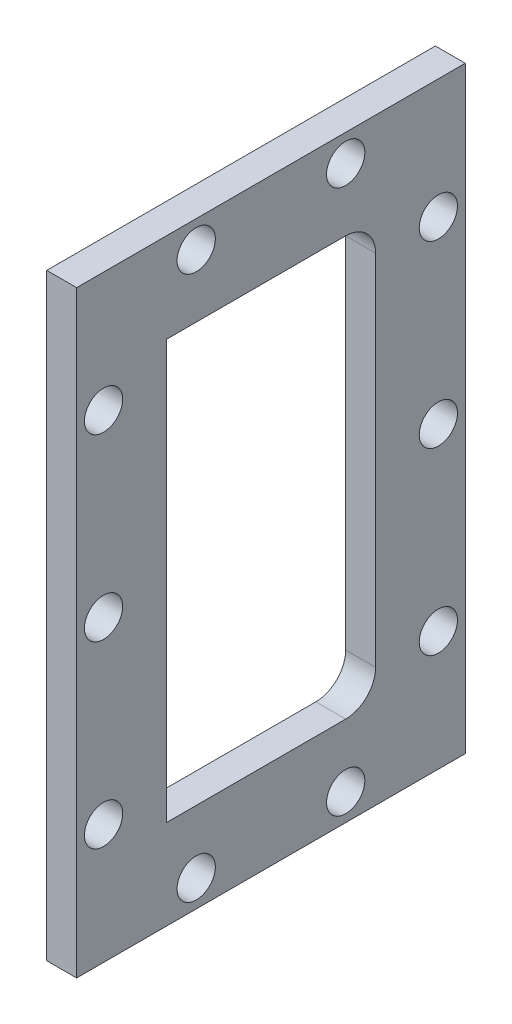
ISO-10303-21;
HEADER;
FILE_DESCRIPTION(('STEP AP214'),'2;1');
FILE_NAME('part.step','',(''),(''),'','','');
FILE_SCHEMA(('AUTOMOTIVE_DESIGN { 1 0 10303 214 1 1 1 1 }'));
ENDSEC;
DATA;
#1=APPLICATION_CONTEXT('core data for automotive mechanical design processes');
#2=APPLICATION_PROTOCOL_DEFINITION('international standard','automotive_design',2000,#1);
#3=PRODUCT_CONTEXT('',#1,'mechanical');
#4=PRODUCT('Part','Part','',(#3));
#5=PRODUCT_RELATED_PRODUCT_CATEGORY('part','',(#4));
#6=PRODUCT_DEFINITION_FORMATION('','',#4);
#7=PRODUCT_DEFINITION_CONTEXT('part definition',#1,'design');
#8=PRODUCT_DEFINITION('design','',#6,#7);
#9=PRODUCT_DEFINITION_SHAPE('','',#8);
#10=(LENGTH_UNIT() NAMED_UNIT(*) SI_UNIT(.MILLI.,.METRE.));
#11=(NAMED_UNIT(*) PLANE_ANGLE_UNIT() SI_UNIT($,.RADIAN.));
#12=(NAMED_UNIT(*) SI_UNIT($,.STERADIAN.) SOLID_ANGLE_UNIT());
#13=UNCERTAINTY_MEASURE_WITH_UNIT(LENGTH_MEASURE(1.E-05),#10,'distance_accuracy_value','');
#14=(GEOMETRIC_REPRESENTATION_CONTEXT(3) GLOBAL_UNCERTAINTY_ASSIGNED_CONTEXT((#13)) GLOBAL_UNIT_ASSIGNED_CONTEXT((#10,
#11,#12)) REPRESENTATION_CONTEXT('',''));
#15=CARTESIAN_POINT('',(0.,0.,0.));
#16=DIRECTION('',(0.,0.,1.));
#17=DIRECTION('',(1.,0.,0.));
#18=AXIS2_PLACEMENT_3D('',#15,#16,#17);
#19=CARTESIAN_POINT('',(4.99999,0.,0.));
#20=DIRECTION('',(-1.,0.,0.));
#21=DIRECTION('',(0.,0.,1.));
#22=AXIS2_PLACEMENT_3D('',#19,#20,#21);
#23=PLANE('',#22);
#24=CARTESIAN_POINT('',(4.99998999999991,19.99996,60.499879));
#25=DIRECTION('',(-1.,0.,0.));
#26=DIRECTION('',(0.,0.,1.));
#27=AXIS2_PLACEMENT_3D('',#24,#25,#26);
#28=CIRCLE('',#27,3.19999360000001);
#29=CARTESIAN_POINT('',(4.99998999999991,19.99996,63.6998726));
#30=VERTEX_POINT('',#29);
#31=EDGE_CURVE('E498',#30,#30,#28,.T.);
#32=ORIENTED_EDGE('',*,*,#31,.T.);
#33=EDGE_LOOP('',(#32));
#34=FACE_BOUND('',#33,.T.);
#35=CARTESIAN_POINT('',(4.99998999999992,4.499991,44.99991));
#36=DIRECTION('',(-1.,0.,0.));
#37=DIRECTION('',(0.,0.,1.));
#38=AXIS2_PLACEMENT_3D('',#35,#36,#37);
#39=CIRCLE('',#38,3.19999360000001);
#40=CARTESIAN_POINT('',(4.99998999999992,4.499991,48.1999036));
#41=VERTEX_POINT('',#40);
#42=EDGE_CURVE('E492',#41,#41,#39,.T.);
#43=ORIENTED_EDGE('',*,*,#42,.T.);
#44=EDGE_LOOP('',(#43));
#45=FACE_BOUND('',#44,.T.);
#46=CARTESIAN_POINT('',(4.99998999999992,4.499991,19.99996));
#47=DIRECTION('',(-1.,0.,0.));
#48=DIRECTION('',(0.,0.,1.));
#49=AXIS2_PLACEMENT_3D('',#46,#47,#48);
#50=CIRCLE('',#49,3.19999360000001);
#51=CARTESIAN_POINT('',(4.99998999999992,4.499991,23.1999536));
#52=VERTEX_POINT('',#51);
#53=EDGE_CURVE('E511',#52,#52,#50,.T.);
#54=ORIENTED_EDGE('',*,*,#53,.T.);
#55=EDGE_LOOP('',(#54));
#56=FACE_BOUND('',#55,.T.);
#57=CARTESIAN_POINT('',(4.99998999999993,19.99996,4.499991));
#58=DIRECTION('',(-1.,0.,0.));
#59=DIRECTION('',(0.,0.,1.));
#60=AXIS2_PLACEMENT_3D('',#57,#58,#59);
#61=CIRCLE('',#60,3.19999360000001);
#62=CARTESIAN_POINT('',(4.99998999999992,19.99996,7.69998460000001));
#63=VERTEX_POINT('',#62);
#64=EDGE_CURVE('E519',#63,#63,#61,.T.);
#65=ORIENTED_EDGE('',*,*,#64,.T.);
#66=EDGE_LOOP('',(#65));
#67=FACE_BOUND('',#66,.T.);
#68=CARTESIAN_POINT('',(4.99998999999993,49.9999,4.499991));
#69=DIRECTION('',(-1.,0.,0.));
#70=DIRECTION('',(0.,0.,1.));
#71=AXIS2_PLACEMENT_3D('',#68,#69,#70);
#72=CIRCLE('',#71,3.19999360000001);
#73=CARTESIAN_POINT('',(4.99998999999992,49.9999,7.69998460000001));
#74=VERTEX_POINT('',#73);
#75=EDGE_CURVE('E527',#74,#74,#72,.T.);
#76=ORIENTED_EDGE('',*,*,#75,.T.);
#77=EDGE_LOOP('',(#76));
#78=FACE_BOUND('',#77,.T.);
#79=CARTESIAN_POINT('',(4.99998999999993,79.99984,4.499991));
#80=DIRECTION('',(-1.,0.,0.));
#81=DIRECTION('',(0.,0.,1.));
#82=AXIS2_PLACEMENT_3D('',#79,#80,#81);
#83=CIRCLE('',#82,3.19999360000001);
#84=CARTESIAN_POINT('',(4.99998999999992,79.99984,7.69998460000001));
#85=VERTEX_POINT('',#84);
#86=EDGE_CURVE('E535',#85,#85,#83,.T.);
#87=ORIENTED_EDGE('',*,*,#86,.T.);
#88=EDGE_LOOP('',(#87));
#89=FACE_BOUND('',#88,.T.);
#90=CARTESIAN_POINT('',(4.99998999999992,95.499809,19.99996));
#91=DIRECTION('',(-1.,0.,0.));
#92=DIRECTION('',(0.,0.,1.));
#93=AXIS2_PLACEMENT_3D('',#90,#91,#92);
#94=CIRCLE('',#93,3.19999360000001);
#95=CARTESIAN_POINT('',(4.99998999999992,95.499809,23.1999536));
#96=VERTEX_POINT('',#95);
#97=EDGE_CURVE('E543',#96,#96,#94,.T.);
#98=ORIENTED_EDGE('',*,*,#97,.T.);
#99=EDGE_LOOP('',(#98));
#100=FACE_BOUND('',#99,.T.);
#101=CARTESIAN_POINT('',(4.99998999999992,95.4998089999999,44.99991));
#102=DIRECTION('',(-1.,0.,0.));
#103=DIRECTION('',(0.,0.,1.));
#104=AXIS2_PLACEMENT_3D('',#101,#102,#103);
#105=CIRCLE('',#104,3.19999360000001);
#106=CARTESIAN_POINT('',(4.99998999999992,95.4998089999999,48.1999036));
#107=VERTEX_POINT('',#106);
#108=EDGE_CURVE('E551',#107,#107,#105,.T.);
#109=ORIENTED_EDGE('',*,*,#108,.T.);
#110=EDGE_LOOP('',(#109));
#111=FACE_BOUND('',#110,.T.);
#112=CARTESIAN_POINT('',(4.99998999999991,79.99984,60.499879));
#113=DIRECTION('',(-1.,0.,0.));
#114=DIRECTION('',(0.,0.,1.));
#115=AXIS2_PLACEMENT_3D('',#112,#113,#114);
#116=CIRCLE('',#115,3.19999360000001);
#117=CARTESIAN_POINT('',(4.99998999999991,79.99984,63.6998726));
#118=VERTEX_POINT('',#117);
#119=EDGE_CURVE('E559',#118,#118,#116,.T.);
#120=ORIENTED_EDGE('',*,*,#119,.T.);
#121=EDGE_LOOP('',(#120));
#122=FACE_BOUND('',#121,.T.);
#123=CARTESIAN_POINT('',(4.99998999999991,49.9999,60.499879));
#124=DIRECTION('',(-1.,0.,0.));
#125=DIRECTION('',(0.,0.,1.));
#126=AXIS2_PLACEMENT_3D('',#123,#124,#125);
#127=CIRCLE('',#126,3.19999360000001);
#128=CARTESIAN_POINT('',(4.99998999999991,49.9999,63.6998726));
#129=VERTEX_POINT('',#128);
#130=EDGE_CURVE('E162',#129,#129,#127,.T.);
#131=ORIENTED_EDGE('',*,*,#130,.T.);
#132=EDGE_LOOP('',(#131));
#133=FACE_BOUND('',#132,.T.);
#134=DIRECTION('',(0.,0.,1.));
#135=VECTOR('',#134,1.);
#136=CARTESIAN_POINT('',(4.99999,0.,0.));
#137=LINE('',#136,#135);
#138=CARTESIAN_POINT('',(4.99999,0.,0.));
#139=VERTEX_POINT('',#138);
#140=CARTESIAN_POINT('',(4.99998999999999,0.,64.99987));
#141=VERTEX_POINT('',#140);
#142=EDGE_CURVE('E186',#139,#141,#137,.T.);
#143=ORIENTED_EDGE('',*,*,#142,.F.);
#144=DIRECTION('',(0.,-1.,0.));
#145=VECTOR('',#144,1.);
#146=CARTESIAN_POINT('',(4.99999,99.9998,0.));
#147=LINE('',#146,#145);
#148=CARTESIAN_POINT('',(4.99999,99.9998,0.));
#149=VERTEX_POINT('',#148);
#150=EDGE_CURVE('E199',#149,#139,#147,.T.);
#151=ORIENTED_EDGE('',*,*,#150,.F.);
#152=DIRECTION('',(0.,0.,-1.));
#153=VECTOR('',#152,1.);
#154=CARTESIAN_POINT('',(4.99998999999999,99.9998,64.99987));
#155=LINE('',#154,#153);
#156=CARTESIAN_POINT('',(4.99998999999999,99.9998,64.99987));
#157=VERTEX_POINT('',#156);
#158=EDGE_CURVE('E195',#157,#149,#155,.T.);
#159=ORIENTED_EDGE('',*,*,#158,.F.);
#160=DIRECTION('',(0.,1.,0.));
#161=VECTOR('',#160,1.);
#162=CARTESIAN_POINT('',(4.99998999999999,0.,64.99987));
#163=LINE('',#162,#161);
#164=EDGE_CURVE('E190',#141,#157,#163,.T.);
#165=ORIENTED_EDGE('',*,*,#164,.F.);
#166=EDGE_LOOP('',(#143,#151,#159,#165));
#167=FACE_BOUND('',#166,.T.);
#168=DIRECTION('',(0.,0.,1.));
#169=VECTOR('',#168,1.);
#170=CARTESIAN_POINT('',(4.9999899999999,84.99983,14.99997));
#171=LINE('',#170,#169);
#172=CARTESIAN_POINT('',(4.9999899999999,84.99983,19.99996));
#173=VERTEX_POINT('',#172);
#174=CARTESIAN_POINT('',(4.9999899999999,84.99983,49.9999));
#175=VERTEX_POINT('',#174);
#176=EDGE_CURVE('E151',#173,#175,#171,.T.);
#177=ORIENTED_EDGE('',*,*,#176,.F.);
#178=CARTESIAN_POINT('',(4.99999,79.99984,19.99996));
#179=DIRECTION('',(-1.,0.,0.));
#180=DIRECTION('',(0.,0.,1.));
#181=AXIS2_PLACEMENT_3D('',#178,#179,#180);
#182=CIRCLE('',#181,4.99999);
#183=CARTESIAN_POINT('',(4.9999899999999,79.99984,14.99997));
#184=VERTEX_POINT('',#183);
#185=EDGE_CURVE('E54',#173,#184,#182,.T.);
#186=ORIENTED_EDGE('',*,*,#185,.T.);
#187=DIRECTION('',(0.,-1.,0.));
#188=VECTOR('',#187,1.);
#189=CARTESIAN_POINT('',(4.9999899999999,84.99983,14.99997));
#190=LINE('',#189,#188);
#191=CARTESIAN_POINT('',(4.9999899999999,19.99996,14.99997));
#192=VERTEX_POINT('',#191);
#193=EDGE_CURVE('E179',#184,#192,#190,.T.);
#194=ORIENTED_EDGE('',*,*,#193,.T.);
#195=CARTESIAN_POINT('',(4.99999,19.99996,19.99996));
#196=DIRECTION('',(-1.,0.,0.));
#197=DIRECTION('',(0.,0.,1.));
#198=AXIS2_PLACEMENT_3D('',#195,#196,#197);
#199=CIRCLE('',#198,4.99999);
#200=CARTESIAN_POINT('',(4.9999899999999,14.99997,19.99996));
#201=VERTEX_POINT('',#200);
#202=EDGE_CURVE('E242',#192,#201,#199,.T.);
#203=ORIENTED_EDGE('',*,*,#202,.T.);
#204=DIRECTION('',(0.,0.,1.));
#205=VECTOR('',#204,1.);
#206=CARTESIAN_POINT('',(4.9999899999999,14.99997,14.99997));
#207=LINE('',#206,#205);
#208=CARTESIAN_POINT('',(4.99998999999999,14.99997,49.9999));
#209=VERTEX_POINT('',#208);
#210=EDGE_CURVE('E165',#201,#209,#207,.T.);
#211=ORIENTED_EDGE('',*,*,#210,.T.);
#212=DIRECTION('',(0.,-1.,0.));
#213=VECTOR('',#212,1.);
#214=CARTESIAN_POINT('',(4.9999899999999,84.99983,49.9999));
#215=LINE('',#214,#213);
#216=EDGE_CURVE('E175',#175,#209,#215,.T.);
#217=ORIENTED_EDGE('',*,*,#216,.F.);
#218=EDGE_LOOP('',(#177,#186,#194,#203,#211,#217));
#219=FACE_BOUND('',#218,.T.);
#220=ADVANCED_FACE('F45',(#34,#45,#56,#67,#78,#89,#100,#111,#122,#133,#167,#219),#23,.F.);
#221=CARTESIAN_POINT('',(0.,0.,0.));
#222=DIRECTION('',(-1.,0.,0.));
#223=DIRECTION('',(0.,0.,1.));
#224=AXIS2_PLACEMENT_3D('',#221,#222,#223);
#225=PLANE('',#224);
#226=CARTESIAN_POINT('',(0.,19.99996,60.499879));
#227=DIRECTION('',(-1.,0.,0.));
#228=DIRECTION('',(0.,0.,1.));
#229=AXIS2_PLACEMENT_3D('',#226,#227,#228);
#230=CIRCLE('',#229,3.19999360000001);
#231=CARTESIAN_POINT('',(0.,19.99996,63.6998726));
#232=VERTEX_POINT('',#231);
#233=EDGE_CURVE('E504',#232,#232,#230,.T.);
#234=ORIENTED_EDGE('',*,*,#233,.F.);
#235=EDGE_LOOP('',(#234));
#236=FACE_BOUND('',#235,.T.);
#237=CARTESIAN_POINT('',(0.,4.499991,44.99991));
#238=DIRECTION('',(-1.,0.,0.));
#239=DIRECTION('',(0.,0.,1.));
#240=AXIS2_PLACEMENT_3D('',#237,#238,#239);
#241=CIRCLE('',#240,3.19999360000001);
#242=CARTESIAN_POINT('',(0.,4.499991,48.1999036));
#243=VERTEX_POINT('',#242);
#244=EDGE_CURVE('E495',#243,#243,#241,.T.);
#245=ORIENTED_EDGE('',*,*,#244,.F.);
#246=EDGE_LOOP('',(#245));
#247=FACE_BOUND('',#246,.T.);
#248=CARTESIAN_POINT('',(0.,4.499991,19.99996));
#249=DIRECTION('',(-1.,0.,0.));
#250=DIRECTION('',(0.,0.,1.));
#251=AXIS2_PLACEMENT_3D('',#248,#249,#250);
#252=CIRCLE('',#251,3.19999360000001);
#253=CARTESIAN_POINT('',(0.,4.499991,23.1999536));
#254=VERTEX_POINT('',#253);
#255=EDGE_CURVE('E502',#254,#254,#252,.T.);
#256=ORIENTED_EDGE('',*,*,#255,.F.);
#257=EDGE_LOOP('',(#256));
#258=FACE_BOUND('',#257,.T.);
#259=CARTESIAN_POINT('',(0.,19.99996,4.499991));
#260=DIRECTION('',(-1.,0.,0.));
#261=DIRECTION('',(0.,0.,1.));
#262=AXIS2_PLACEMENT_3D('',#259,#260,#261);
#263=CIRCLE('',#262,3.19999360000001);
#264=CARTESIAN_POINT('',(0.,19.99996,7.69998460000001));
#265=VERTEX_POINT('',#264);
#266=EDGE_CURVE('E515',#265,#265,#263,.T.);
#267=ORIENTED_EDGE('',*,*,#266,.F.);
#268=EDGE_LOOP('',(#267));
#269=FACE_BOUND('',#268,.T.);
#270=CARTESIAN_POINT('',(0.,49.9999,4.499991));
#271=DIRECTION('',(-1.,0.,0.));
#272=DIRECTION('',(0.,0.,1.));
#273=AXIS2_PLACEMENT_3D('',#270,#271,#272);
#274=CIRCLE('',#273,3.19999360000001);
#275=CARTESIAN_POINT('',(0.,49.9999,7.69998460000001));
#276=VERTEX_POINT('',#275);
#277=EDGE_CURVE('E523',#276,#276,#274,.T.);
#278=ORIENTED_EDGE('',*,*,#277,.F.);
#279=EDGE_LOOP('',(#278));
#280=FACE_BOUND('',#279,.T.);
#281=CARTESIAN_POINT('',(0.,79.99984,4.499991));
#282=DIRECTION('',(-1.,0.,0.));
#283=DIRECTION('',(0.,0.,1.));
#284=AXIS2_PLACEMENT_3D('',#281,#282,#283);
#285=CIRCLE('',#284,3.19999360000001);
#286=CARTESIAN_POINT('',(0.,79.99984,7.69998460000001));
#287=VERTEX_POINT('',#286);
#288=EDGE_CURVE('E531',#287,#287,#285,.T.);
#289=ORIENTED_EDGE('',*,*,#288,.F.);
#290=EDGE_LOOP('',(#289));
#291=FACE_BOUND('',#290,.T.);
#292=CARTESIAN_POINT('',(0.,95.499809,19.99996));
#293=DIRECTION('',(-1.,0.,0.));
#294=DIRECTION('',(0.,0.,1.));
#295=AXIS2_PLACEMENT_3D('',#292,#293,#294);
#296=CIRCLE('',#295,3.19999360000001);
#297=CARTESIAN_POINT('',(0.,95.499809,23.1999536));
#298=VERTEX_POINT('',#297);
#299=EDGE_CURVE('E539',#298,#298,#296,.T.);
#300=ORIENTED_EDGE('',*,*,#299,.F.);
#301=EDGE_LOOP('',(#300));
#302=FACE_BOUND('',#301,.T.);
#303=CARTESIAN_POINT('',(0.,95.4998089999999,44.99991));
#304=DIRECTION('',(-1.,0.,0.));
#305=DIRECTION('',(0.,0.,1.));
#306=AXIS2_PLACEMENT_3D('',#303,#304,#305);
#307=CIRCLE('',#306,3.19999360000001);
#308=CARTESIAN_POINT('',(0.,95.4998089999999,48.1999036));
#309=VERTEX_POINT('',#308);
#310=EDGE_CURVE('E547',#309,#309,#307,.T.);
#311=ORIENTED_EDGE('',*,*,#310,.F.);
#312=EDGE_LOOP('',(#311));
#313=FACE_BOUND('',#312,.T.);
#314=CARTESIAN_POINT('',(0.,79.99984,60.499879));
#315=DIRECTION('',(-1.,0.,0.));
#316=DIRECTION('',(0.,0.,1.));
#317=AXIS2_PLACEMENT_3D('',#314,#315,#316);
#318=CIRCLE('',#317,3.19999360000001);
#319=CARTESIAN_POINT('',(0.,79.99984,63.6998726));
#320=VERTEX_POINT('',#319);
#321=EDGE_CURVE('E555',#320,#320,#318,.T.);
#322=ORIENTED_EDGE('',*,*,#321,.F.);
#323=EDGE_LOOP('',(#322));
#324=FACE_BOUND('',#323,.T.);
#325=CARTESIAN_POINT('',(0.,49.9999,60.499879));
#326=DIRECTION('',(-1.,0.,0.));
#327=DIRECTION('',(0.,0.,1.));
#328=AXIS2_PLACEMENT_3D('',#325,#326,#327);
#329=CIRCLE('',#328,3.19999360000001);
#330=CARTESIAN_POINT('',(0.,49.9999,63.6998726));
#331=VERTEX_POINT('',#330);
#332=EDGE_CURVE('E563',#331,#331,#329,.T.);
#333=ORIENTED_EDGE('',*,*,#332,.F.);
#334=EDGE_LOOP('',(#333));
#335=FACE_BOUND('',#334,.T.);
#336=DIRECTION('',(0.,0.,1.));
#337=VECTOR('',#336,1.);
#338=CARTESIAN_POINT('',(0.,0.,0.));
#339=LINE('',#338,#337);
#340=CARTESIAN_POINT('',(0.,0.,0.));
#341=VERTEX_POINT('',#340);
#342=CARTESIAN_POINT('',(0.,0.,64.99987));
#343=VERTEX_POINT('',#342);
#344=EDGE_CURVE('E174',#341,#343,#339,.T.);
#345=ORIENTED_EDGE('',*,*,#344,.T.);
#346=DIRECTION('',(0.,1.,0.));
#347=VECTOR('',#346,1.);
#348=CARTESIAN_POINT('',(0.,0.,64.99987));
#349=LINE('',#348,#347);
#350=CARTESIAN_POINT('',(0.,99.9998,64.99987));
#351=VERTEX_POINT('',#350);
#352=EDGE_CURVE('E207',#343,#351,#349,.T.);
#353=ORIENTED_EDGE('',*,*,#352,.T.);
#354=DIRECTION('',(0.,0.,-1.));
#355=VECTOR('',#354,1.);
#356=CARTESIAN_POINT('',(0.,99.9998,64.99987));
#357=LINE('',#356,#355);
#358=CARTESIAN_POINT('',(0.,99.9998,0.));
#359=VERTEX_POINT('',#358);
#360=EDGE_CURVE('E211',#351,#359,#357,.T.);
#361=ORIENTED_EDGE('',*,*,#360,.T.);
#362=DIRECTION('',(0.,-1.,0.));
#363=VECTOR('',#362,1.);
#364=CARTESIAN_POINT('',(0.,99.9998,0.));
#365=LINE('',#364,#363);
#366=EDGE_CURVE('E191',#359,#341,#365,.T.);
#367=ORIENTED_EDGE('',*,*,#366,.T.);
#368=EDGE_LOOP('',(#345,#353,#361,#367));
#369=FACE_BOUND('',#368,.T.);
#370=DIRECTION('',(0.,-1.,0.));
#371=VECTOR('',#370,1.);
#372=CARTESIAN_POINT('',(0.,84.99983,14.99997));
#373=LINE('',#372,#371);
#374=CARTESIAN_POINT('',(0.,79.99984,14.99997));
#375=VERTEX_POINT('',#374);
#376=CARTESIAN_POINT('',(0.,19.99996,14.99997));
#377=VERTEX_POINT('',#376);
#378=EDGE_CURVE('E139',#375,#377,#373,.T.);
#379=ORIENTED_EDGE('',*,*,#378,.F.);
#380=CARTESIAN_POINT('',(0.,79.99984,19.99996));
#381=DIRECTION('',(-1.,0.,0.));
#382=DIRECTION('',(0.,0.,1.));
#383=AXIS2_PLACEMENT_3D('',#380,#381,#382);
#384=CIRCLE('',#383,4.99999);
#385=CARTESIAN_POINT('',(0.,84.99983,19.99996));
#386=VERTEX_POINT('',#385);
#387=EDGE_CURVE('E11',#375,#386,#384,.F.);
#388=ORIENTED_EDGE('',*,*,#387,.T.);
#389=DIRECTION('',(0.,0.,-1.));
#390=VECTOR('',#389,1.);
#391=CARTESIAN_POINT('',(0.,84.99983,53.999892));
#392=LINE('',#391,#390);
#393=CARTESIAN_POINT('',(0.,84.99983,53.999892));
#394=VERTEX_POINT('',#393);
#395=EDGE_CURVE('E144',#394,#386,#392,.T.);
#396=ORIENTED_EDGE('',*,*,#395,.F.);
#397=DIRECTION('',(0.,-1.,0.));
#398=VECTOR('',#397,1.);
#399=CARTESIAN_POINT('',(0.,84.99983,53.999892));
#400=LINE('',#399,#398);
#401=CARTESIAN_POINT('',(0.,14.99997,53.999892));
#402=VERTEX_POINT('',#401);
#403=EDGE_CURVE('E130',#394,#402,#400,.T.);
#404=ORIENTED_EDGE('',*,*,#403,.T.);
#405=DIRECTION('',(0.,0.,-1.));
#406=VECTOR('',#405,1.);
#407=CARTESIAN_POINT('',(0.,14.99997,53.999892));
#408=LINE('',#407,#406);
#409=CARTESIAN_POINT('',(0.,14.99997,19.99996));
#410=VERTEX_POINT('',#409);
#411=EDGE_CURVE('E161',#402,#410,#408,.T.);
#412=ORIENTED_EDGE('',*,*,#411,.T.);
#413=CARTESIAN_POINT('',(0.,19.99996,19.99996));
#414=DIRECTION('',(-1.,0.,0.));
#415=DIRECTION('',(0.,0.,1.));
#416=AXIS2_PLACEMENT_3D('',#413,#414,#415);
#417=CIRCLE('',#416,4.99999);
#418=EDGE_CURVE('E245',#410,#377,#417,.F.);
#419=ORIENTED_EDGE('',*,*,#418,.T.);
#420=EDGE_LOOP('',(#379,#388,#396,#404,#412,#419));
#421=FACE_BOUND('',#420,.T.);
#422=ADVANCED_FACE('F149',(#236,#247,#258,#269,#280,#291,#302,#313,#324,#335,#369,#421),#225,.T.);
#423=CARTESIAN_POINT('',(4.99999,0.,0.));
#424=DIRECTION('',(0.,-1.,0.));
#425=DIRECTION('',(0.,0.,-1.));
#426=AXIS2_PLACEMENT_3D('',#423,#424,#425);
#427=PLANE('',#426);
#428=ORIENTED_EDGE('',*,*,#344,.F.);
#429=DIRECTION('',(-1.,0.,0.));
#430=VECTOR('',#429,1.);
#431=CARTESIAN_POINT('',(4.99999,0.,0.));
#432=LINE('',#431,#430);
#433=EDGE_CURVE('E218',#139,#341,#432,.T.);
#434=ORIENTED_EDGE('',*,*,#433,.F.);
#435=ORIENTED_EDGE('',*,*,#142,.T.);
#436=DIRECTION('',(-1.,0.,0.));
#437=VECTOR('',#436,1.);
#438=CARTESIAN_POINT('',(4.99998999999999,0.,64.99987));
#439=LINE('',#438,#437);
#440=EDGE_CURVE('E203',#141,#343,#439,.T.);
#441=ORIENTED_EDGE('',*,*,#440,.T.);
#442=EDGE_LOOP('',(#428,#434,#435,#441));
#443=FACE_BOUND('',#442,.T.);
#444=ADVANCED_FACE('F282',(#443),#427,.T.);
#445=CARTESIAN_POINT('',(4.99999,99.9998,0.));
#446=DIRECTION('',(0.,0.,-1.));
#447=DIRECTION('',(-1.,0.,0.));
#448=AXIS2_PLACEMENT_3D('',#445,#446,#447);
#449=PLANE('',#448);
#450=ORIENTED_EDGE('',*,*,#366,.F.);
#451=DIRECTION('',(-1.,0.,0.));
#452=VECTOR('',#451,1.);
#453=CARTESIAN_POINT('',(4.99999,99.9998,0.));
#454=LINE('',#453,#452);
#455=EDGE_CURVE('E222',#149,#359,#454,.T.);
#456=ORIENTED_EDGE('',*,*,#455,.F.);
#457=ORIENTED_EDGE('',*,*,#150,.T.);
#458=ORIENTED_EDGE('',*,*,#433,.T.);
#459=EDGE_LOOP('',(#450,#456,#457,#458));
#460=FACE_BOUND('',#459,.T.);
#461=ADVANCED_FACE('F290',(#460),#449,.T.);
#462=CARTESIAN_POINT('',(4.99998999999999,99.9998,64.99987));
#463=DIRECTION('',(0.,1.,0.));
#464=DIRECTION('',(0.,0.,1.));
#465=AXIS2_PLACEMENT_3D('',#462,#463,#464);
#466=PLANE('',#465);
#467=ORIENTED_EDGE('',*,*,#360,.F.);
#468=DIRECTION('',(-1.,0.,0.));
#469=VECTOR('',#468,1.);
#470=CARTESIAN_POINT('',(4.99998999999999,99.9998,64.99987));
#471=LINE('',#470,#469);
#472=EDGE_CURVE('E225',#157,#351,#471,.T.);
#473=ORIENTED_EDGE('',*,*,#472,.F.);
#474=ORIENTED_EDGE('',*,*,#158,.T.);
#475=ORIENTED_EDGE('',*,*,#455,.T.);
#476=EDGE_LOOP('',(#467,#473,#474,#475));
#477=FACE_BOUND('',#476,.T.);
#478=ADVANCED_FACE('F293',(#477),#466,.T.);
#479=CARTESIAN_POINT('',(4.99998999999999,0.,64.99987));
#480=DIRECTION('',(0.,0.,1.));
#481=DIRECTION('',(1.,0.,0.));
#482=AXIS2_PLACEMENT_3D('',#479,#480,#481);
#483=PLANE('',#482);
#484=ORIENTED_EDGE('',*,*,#352,.F.);
#485=ORIENTED_EDGE('',*,*,#440,.F.);
#486=ORIENTED_EDGE('',*,*,#164,.T.);
#487=ORIENTED_EDGE('',*,*,#472,.T.);
#488=EDGE_LOOP('',(#484,#485,#486,#487));
#489=FACE_BOUND('',#488,.T.);
#490=ADVANCED_FACE('F297',(#489),#483,.T.);
#491=CARTESIAN_POINT('',(3.99999199999991,84.99983,49.9999));
#492=DIRECTION('',(0.707106781186547,0.,0.707106781186548));
#493=DIRECTION('',(0.707106781186548,0.,-0.707106781186547));
#494=AXIS2_PLACEMENT_3D('',#491,#492,#493);
#495=PLANE('',#494);
#496=DIRECTION('',(-0.707106781186548,0.,0.707106781186547));
#497=VECTOR('',#496,1.);
#498=CARTESIAN_POINT('',(3.99999199999991,14.99997,49.9999));
#499=LINE('',#498,#497);
#500=CARTESIAN_POINT('',(3.99999199999991,14.99997,49.9999));
#501=VERTEX_POINT('',#500);
#502=EDGE_CURVE('E136',#501,#402,#499,.T.);
#503=ORIENTED_EDGE('',*,*,#502,.T.);
#504=ORIENTED_EDGE('',*,*,#403,.F.);
#505=DIRECTION('',(-0.707106781186548,0.,0.707106781186547));
#506=VECTOR('',#505,1.);
#507=CARTESIAN_POINT('',(3.99999199999991,84.99983,49.9999));
#508=LINE('',#507,#506);
#509=CARTESIAN_POINT('',(3.99999199999991,84.99983,49.9999));
#510=VERTEX_POINT('',#509);
#511=EDGE_CURVE('E133',#510,#394,#508,.T.);
#512=ORIENTED_EDGE('',*,*,#511,.F.);
#513=DIRECTION('',(0.,-1.,0.));
#514=VECTOR('',#513,1.);
#515=CARTESIAN_POINT('',(3.99999199999991,84.99983,49.9999));
#516=LINE('',#515,#514);
#517=EDGE_CURVE('E171',#510,#501,#516,.T.);
#518=ORIENTED_EDGE('',*,*,#517,.T.);
#519=EDGE_LOOP('',(#503,#504,#512,#518));
#520=FACE_BOUND('',#519,.T.);
#521=ADVANCED_FACE('F132',(#520),#495,.F.);
#522=CARTESIAN_POINT('',(4.9999899999999,84.99983,49.9999));
#523=DIRECTION('',(0.,0.,1.));
#524=DIRECTION('',(1.,0.,0.));
#525=AXIS2_PLACEMENT_3D('',#522,#523,#524);
#526=PLANE('',#525);
#527=DIRECTION('',(-1.,0.,0.));
#528=VECTOR('',#527,1.);
#529=CARTESIAN_POINT('',(4.9999899999999,14.99997,49.9999));
#530=LINE('',#529,#528);
#531=EDGE_CURVE('E147',#209,#501,#530,.T.);
#532=ORIENTED_EDGE('',*,*,#531,.T.);
#533=ORIENTED_EDGE('',*,*,#517,.F.);
#534=DIRECTION('',(-1.,0.,0.));
#535=VECTOR('',#534,1.);
#536=CARTESIAN_POINT('',(4.9999899999999,84.99983,49.9999));
#537=LINE('',#536,#535);
#538=EDGE_CURVE('E140',#175,#510,#537,.T.);
#539=ORIENTED_EDGE('',*,*,#538,.F.);
#540=ORIENTED_EDGE('',*,*,#216,.T.);
#541=EDGE_LOOP('',(#532,#533,#539,#540));
#542=FACE_BOUND('',#541,.T.);
#543=ADVANCED_FACE('F256',(#542),#526,.F.);
#544=CARTESIAN_POINT('',(0.,84.99983,14.99997));
#545=DIRECTION('',(0.,0.,-1.));
#546=DIRECTION('',(-1.,0.,0.));
#547=AXIS2_PLACEMENT_3D('',#544,#545,#546);
#548=PLANE('',#547);
#549=ORIENTED_EDGE('',*,*,#378,.T.);
#550=DIRECTION('',(1.,0.,0.));
#551=VECTOR('',#550,1.);
#552=CARTESIAN_POINT('',(4.9999899999999,19.99996,14.99997));
#553=LINE('',#552,#551);
#554=EDGE_CURVE('E232',#377,#192,#553,.T.);
#555=ORIENTED_EDGE('',*,*,#554,.T.);
#556=ORIENTED_EDGE('',*,*,#193,.F.);
#557=DIRECTION('',(1.,0.,0.));
#558=VECTOR('',#557,1.);
#559=CARTESIAN_POINT('',(0.,79.99984,14.99997));
#560=LINE('',#559,#558);
#561=EDGE_CURVE('E221',#184,#375,#560,.F.);
#562=ORIENTED_EDGE('',*,*,#561,.T.);
#563=EDGE_LOOP('',(#549,#555,#556,#562));
#564=FACE_BOUND('',#563,.T.);
#565=ADVANCED_FACE('F253',(#564),#548,.F.);
#566=CARTESIAN_POINT('',(0.,84.99983,0.));
#567=DIRECTION('',(0.,-1.,0.));
#568=DIRECTION('',(0.,0.,-1.));
#569=AXIS2_PLACEMENT_3D('',#566,#567,#568);
#570=PLANE('',#569);
#571=ORIENTED_EDGE('',*,*,#395,.T.);
#572=DIRECTION('',(1.,0.,0.));
#573=VECTOR('',#572,1.);
#574=CARTESIAN_POINT('',(0.,84.99983,19.99996));
#575=LINE('',#574,#573);
#576=EDGE_CURVE('E239',#386,#173,#575,.T.);
#577=ORIENTED_EDGE('',*,*,#576,.T.);
#578=ORIENTED_EDGE('',*,*,#176,.T.);
#579=ORIENTED_EDGE('',*,*,#538,.T.);
#580=ORIENTED_EDGE('',*,*,#511,.T.);
#581=EDGE_LOOP('',(#571,#577,#578,#579,#580));
#582=FACE_BOUND('',#581,.T.);
#583=ADVANCED_FACE('F143',(#582),#570,.T.);
#584=CARTESIAN_POINT('',(0.,14.99997,0.));
#585=DIRECTION('',(0.,-1.,0.));
#586=DIRECTION('',(0.,0.,-1.));
#587=AXIS2_PLACEMENT_3D('',#584,#585,#586);
#588=PLANE('',#587);
#589=ORIENTED_EDGE('',*,*,#210,.F.);
#590=DIRECTION('',(1.,0.,0.));
#591=VECTOR('',#590,1.);
#592=CARTESIAN_POINT('',(0.,14.99997,19.99996));
#593=LINE('',#592,#591);
#594=EDGE_CURVE('E236',#201,#410,#593,.F.);
#595=ORIENTED_EDGE('',*,*,#594,.T.);
#596=ORIENTED_EDGE('',*,*,#411,.F.);
#597=ORIENTED_EDGE('',*,*,#502,.F.);
#598=ORIENTED_EDGE('',*,*,#531,.F.);
#599=EDGE_LOOP('',(#589,#595,#596,#597,#598));
#600=FACE_BOUND('',#599,.T.);
#601=ADVANCED_FACE('F261',(#600),#588,.F.);
#602=CARTESIAN_POINT('',(0.,49.9999,60.499879));
#603=DIRECTION('',(-1.,0.,0.));
#604=DIRECTION('',(0.,0.,1.));
#605=AXIS2_PLACEMENT_3D('',#602,#603,#604);
#606=CYLINDRICAL_SURFACE('',#605,3.19999360000001);
#607=ORIENTED_EDGE('',*,*,#130,.F.);
#608=EDGE_LOOP('',(#607));
#609=FACE_BOUND('',#608,.T.);
#610=ORIENTED_EDGE('',*,*,#332,.T.);
#611=EDGE_LOOP('',(#610));
#612=FACE_BOUND('',#611,.T.);
#613=ADVANCED_FACE('F350',(#609,#612),#606,.F.);
#614=CARTESIAN_POINT('',(0.,79.99984,60.499879));
#615=DIRECTION('',(-1.,0.,0.));
#616=DIRECTION('',(0.,0.,1.));
#617=AXIS2_PLACEMENT_3D('',#614,#615,#616);
#618=CYLINDRICAL_SURFACE('',#617,3.19999360000001);
#619=ORIENTED_EDGE('',*,*,#119,.F.);
#620=EDGE_LOOP('',(#619));
#621=FACE_BOUND('',#620,.T.);
#622=ORIENTED_EDGE('',*,*,#321,.T.);
#623=EDGE_LOOP('',(#622));
#624=FACE_BOUND('',#623,.T.);
#625=ADVANCED_FACE('F354',(#621,#624),#618,.F.);
#626=CARTESIAN_POINT('',(0.,95.4998089999999,44.99991));
#627=DIRECTION('',(-1.,0.,0.));
#628=DIRECTION('',(0.,0.,1.));
#629=AXIS2_PLACEMENT_3D('',#626,#627,#628);
#630=CYLINDRICAL_SURFACE('',#629,3.19999360000001);
#631=ORIENTED_EDGE('',*,*,#108,.F.);
#632=EDGE_LOOP('',(#631));
#633=FACE_BOUND('',#632,.T.);
#634=ORIENTED_EDGE('',*,*,#310,.T.);
#635=EDGE_LOOP('',(#634));
#636=FACE_BOUND('',#635,.T.);
#637=ADVANCED_FACE('F364',(#633,#636),#630,.F.);
#638=CARTESIAN_POINT('',(0.,95.499809,19.99996));
#639=DIRECTION('',(-1.,0.,0.));
#640=DIRECTION('',(0.,0.,1.));
#641=AXIS2_PLACEMENT_3D('',#638,#639,#640);
#642=CYLINDRICAL_SURFACE('',#641,3.19999360000001);
#643=ORIENTED_EDGE('',*,*,#97,.F.);
#644=EDGE_LOOP('',(#643));
#645=FACE_BOUND('',#644,.T.);
#646=ORIENTED_EDGE('',*,*,#299,.T.);
#647=EDGE_LOOP('',(#646));
#648=FACE_BOUND('',#647,.T.);
#649=ADVANCED_FACE('F373',(#645,#648),#642,.F.);
#650=CARTESIAN_POINT('',(0.,79.99984,4.499991));
#651=DIRECTION('',(-1.,0.,0.));
#652=DIRECTION('',(0.,0.,1.));
#653=AXIS2_PLACEMENT_3D('',#650,#651,#652);
#654=CYLINDRICAL_SURFACE('',#653,3.19999360000001);
#655=ORIENTED_EDGE('',*,*,#86,.F.);
#656=EDGE_LOOP('',(#655));
#657=FACE_BOUND('',#656,.T.);
#658=ORIENTED_EDGE('',*,*,#288,.T.);
#659=EDGE_LOOP('',(#658));
#660=FACE_BOUND('',#659,.T.);
#661=ADVANCED_FACE('F382',(#657,#660),#654,.F.);
#662=CARTESIAN_POINT('',(0.,49.9999,4.499991));
#663=DIRECTION('',(-1.,0.,0.));
#664=DIRECTION('',(0.,0.,1.));
#665=AXIS2_PLACEMENT_3D('',#662,#663,#664);
#666=CYLINDRICAL_SURFACE('',#665,3.19999360000001);
#667=ORIENTED_EDGE('',*,*,#75,.F.);
#668=EDGE_LOOP('',(#667));
#669=FACE_BOUND('',#668,.T.);
#670=ORIENTED_EDGE('',*,*,#277,.T.);
#671=EDGE_LOOP('',(#670));
#672=FACE_BOUND('',#671,.T.);
#673=ADVANCED_FACE('F391',(#669,#672),#666,.F.);
#674=CARTESIAN_POINT('',(0.,19.99996,4.499991));
#675=DIRECTION('',(-1.,0.,0.));
#676=DIRECTION('',(0.,0.,1.));
#677=AXIS2_PLACEMENT_3D('',#674,#675,#676);
#678=CYLINDRICAL_SURFACE('',#677,3.19999360000001);
#679=ORIENTED_EDGE('',*,*,#64,.F.);
#680=EDGE_LOOP('',(#679));
#681=FACE_BOUND('',#680,.T.);
#682=ORIENTED_EDGE('',*,*,#266,.T.);
#683=EDGE_LOOP('',(#682));
#684=FACE_BOUND('',#683,.T.);
#685=ADVANCED_FACE('F400',(#681,#684),#678,.F.);
#686=CARTESIAN_POINT('',(0.,4.499991,19.99996));
#687=DIRECTION('',(-1.,0.,0.));
#688=DIRECTION('',(0.,0.,1.));
#689=AXIS2_PLACEMENT_3D('',#686,#687,#688);
#690=CYLINDRICAL_SURFACE('',#689,3.19999360000001);
#691=ORIENTED_EDGE('',*,*,#53,.F.);
#692=EDGE_LOOP('',(#691));
#693=FACE_BOUND('',#692,.T.);
#694=ORIENTED_EDGE('',*,*,#255,.T.);
#695=EDGE_LOOP('',(#694));
#696=FACE_BOUND('',#695,.T.);
#697=ADVANCED_FACE('F409',(#693,#696),#690,.F.);
#698=CARTESIAN_POINT('',(0.,4.499991,44.99991));
#699=DIRECTION('',(-1.,0.,0.));
#700=DIRECTION('',(0.,0.,1.));
#701=AXIS2_PLACEMENT_3D('',#698,#699,#700);
#702=CYLINDRICAL_SURFACE('',#701,3.19999360000001);
#703=ORIENTED_EDGE('',*,*,#42,.F.);
#704=EDGE_LOOP('',(#703));
#705=FACE_BOUND('',#704,.T.);
#706=ORIENTED_EDGE('',*,*,#244,.T.);
#707=EDGE_LOOP('',(#706));
#708=FACE_BOUND('',#707,.T.);
#709=ADVANCED_FACE('F272',(#705,#708),#702,.F.);
#710=CARTESIAN_POINT('',(0.,19.99996,60.499879));
#711=DIRECTION('',(-1.,0.,0.));
#712=DIRECTION('',(0.,0.,1.));
#713=AXIS2_PLACEMENT_3D('',#710,#711,#712);
#714=CYLINDRICAL_SURFACE('',#713,3.19999360000001);
#715=ORIENTED_EDGE('',*,*,#31,.F.);
#716=EDGE_LOOP('',(#715));
#717=FACE_BOUND('',#716,.T.);
#718=ORIENTED_EDGE('',*,*,#233,.T.);
#719=EDGE_LOOP('',(#718));
#720=FACE_BOUND('',#719,.T.);
#721=ADVANCED_FACE('F266',(#717,#720),#714,.F.);
#722=CARTESIAN_POINT('',(0.,19.99996,19.99996));
#723=DIRECTION('',(-1.,0.,0.));
#724=DIRECTION('',(0.,0.,1.));
#725=AXIS2_PLACEMENT_3D('',#722,#723,#724);
#726=CYLINDRICAL_SURFACE('',#725,4.99999);
#727=ORIENTED_EDGE('',*,*,#418,.F.);
#728=ORIENTED_EDGE('',*,*,#594,.F.);
#729=ORIENTED_EDGE('',*,*,#202,.F.);
#730=ORIENTED_EDGE('',*,*,#554,.F.);
#731=EDGE_LOOP('',(#727,#728,#729,#730));
#732=FACE_BOUND('',#731,.T.);
#733=ADVANCED_FACE('F264',(#732),#726,.F.);
#734=CARTESIAN_POINT('',(0.,79.99984,19.99996));
#735=DIRECTION('',(1.,0.,0.));
#736=DIRECTION('',(0.,0.,-1.));
#737=AXIS2_PLACEMENT_3D('',#734,#735,#736);
#738=CYLINDRICAL_SURFACE('',#737,4.99999);
#739=ORIENTED_EDGE('',*,*,#387,.F.);
#740=ORIENTED_EDGE('',*,*,#561,.F.);
#741=ORIENTED_EDGE('',*,*,#185,.F.);
#742=ORIENTED_EDGE('',*,*,#576,.F.);
#743=EDGE_LOOP('',(#739,#740,#741,#742));
#744=FACE_BOUND('',#743,.T.);
#745=ADVANCED_FACE('F47',(#744),#738,.F.);
#746=CLOSED_SHELL('',(#220,#422,#444,#461,#478,#490,#521,#543,#565,#583,#601,#613,#625,#637,
#649,#661,#673,#685,#697,#709,#721,#733,#745));
#747=MANIFOLD_SOLID_BREP('B2',#746);
#748=ADVANCED_BREP_SHAPE_REPRESENTATION('',(#18,#747),#14);
#749=SHAPE_DEFINITION_REPRESENTATION(#9,#748);
ENDSEC;
END-ISO-10303-21;
